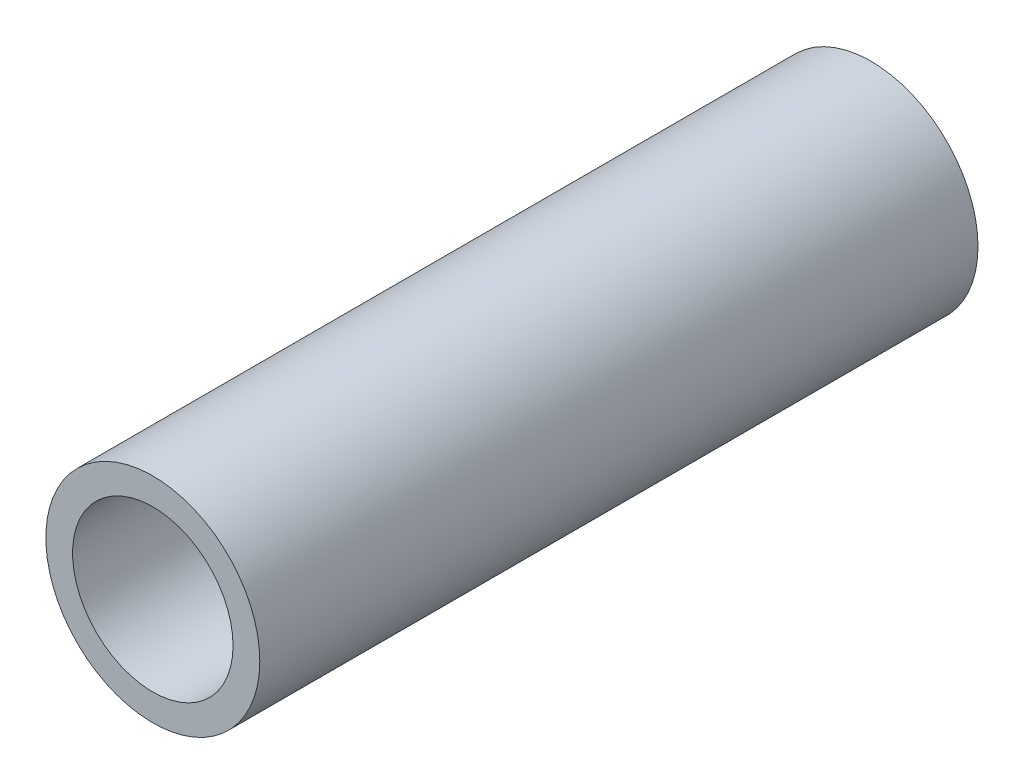
ISO-10303-21;
HEADER;
FILE_DESCRIPTION(('STEP AP214'),'2;1');
FILE_NAME('part.step','',(''),(''),'','','');
FILE_SCHEMA(('AUTOMOTIVE_DESIGN { 1 0 10303 214 1 1 1 1 }'));
ENDSEC;
DATA;
#1=APPLICATION_CONTEXT('core data for automotive mechanical design processes');
#2=APPLICATION_PROTOCOL_DEFINITION('international standard','automotive_design',2000,#1);
#3=PRODUCT_CONTEXT('',#1,'mechanical');
#4=PRODUCT('Part','Part','',(#3));
#5=PRODUCT_RELATED_PRODUCT_CATEGORY('part','',(#4));
#6=PRODUCT_DEFINITION_FORMATION('','',#4);
#7=PRODUCT_DEFINITION_CONTEXT('part definition',#1,'design');
#8=PRODUCT_DEFINITION('design','',#6,#7);
#9=PRODUCT_DEFINITION_SHAPE('','',#8);
#10=(LENGTH_UNIT() NAMED_UNIT(*) SI_UNIT(.MILLI.,.METRE.));
#11=(NAMED_UNIT(*) PLANE_ANGLE_UNIT() SI_UNIT($,.RADIAN.));
#12=(NAMED_UNIT(*) SI_UNIT($,.STERADIAN.) SOLID_ANGLE_UNIT());
#13=UNCERTAINTY_MEASURE_WITH_UNIT(LENGTH_MEASURE(1.E-05),#10,'distance_accuracy_value','');
#14=(GEOMETRIC_REPRESENTATION_CONTEXT(3) GLOBAL_UNCERTAINTY_ASSIGNED_CONTEXT((#13)) GLOBAL_UNIT_ASSIGNED_CONTEXT((#10,
#11,#12)) REPRESENTATION_CONTEXT('',''));
#15=CARTESIAN_POINT('',(0.,0.,0.));
#16=DIRECTION('',(0.,0.,1.));
#17=DIRECTION('',(1.,0.,0.));
#18=AXIS2_PLACEMENT_3D('',#15,#16,#17);
#19=CARTESIAN_POINT('',(0.,0.,28.2));
#20=DIRECTION('',(0.,0.,1.));
#21=DIRECTION('',(1.,0.,0.));
#22=AXIS2_PLACEMENT_3D('',#19,#20,#21);
#23=PLANE('',#22);
#24=CARTESIAN_POINT('',(0.,0.,28.2));
#25=DIRECTION('',(0.,0.,1.));
#26=DIRECTION('',(1.,0.,0.));
#27=AXIS2_PLACEMENT_3D('',#24,#25,#26);
#28=CIRCLE('',#27,4.2);
#29=CARTESIAN_POINT('',(4.2,0.,28.2));
#30=VERTEX_POINT('',#29);
#31=EDGE_CURVE('E10',#30,#30,#28,.T.);
#32=ORIENTED_EDGE('',*,*,#31,.T.);
#33=EDGE_LOOP('',(#32));
#34=FACE_BOUND('',#33,.T.);
#35=CARTESIAN_POINT('',(0.,0.,28.2));
#36=DIRECTION('',(0.,0.,1.));
#37=DIRECTION('',(1.,0.,0.));
#38=AXIS2_PLACEMENT_3D('',#35,#36,#37);
#39=CIRCLE('',#38,3.15);
#40=CARTESIAN_POINT('',(3.15,0.,28.2));
#41=VERTEX_POINT('',#40);
#42=EDGE_CURVE('E48',#41,#41,#39,.T.);
#43=ORIENTED_EDGE('',*,*,#42,.F.);
#44=EDGE_LOOP('',(#43));
#45=FACE_BOUND('',#44,.T.);
#46=ADVANCED_FACE('F40',(#34,#45),#23,.T.);
#47=CARTESIAN_POINT('',(0.,0.,0.));
#48=DIRECTION('',(0.,0.,1.));
#49=DIRECTION('',(1.,0.,0.));
#50=AXIS2_PLACEMENT_3D('',#47,#48,#49);
#51=PLANE('',#50);
#52=CARTESIAN_POINT('',(0.,0.,0.));
#53=DIRECTION('',(0.,0.,1.));
#54=DIRECTION('',(1.,0.,0.));
#55=AXIS2_PLACEMENT_3D('',#52,#53,#54);
#56=CIRCLE('',#55,4.2);
#57=CARTESIAN_POINT('',(4.2,0.,0.));
#58=VERTEX_POINT('',#57);
#59=EDGE_CURVE('E41',#58,#58,#56,.T.);
#60=ORIENTED_EDGE('',*,*,#59,.F.);
#61=EDGE_LOOP('',(#60));
#62=FACE_BOUND('',#61,.T.);
#63=CARTESIAN_POINT('',(0.,0.,0.));
#64=DIRECTION('',(0.,0.,1.));
#65=DIRECTION('',(1.,0.,0.));
#66=AXIS2_PLACEMENT_3D('',#63,#64,#65);
#67=CIRCLE('',#66,3.15);
#68=CARTESIAN_POINT('',(3.15,0.,0.));
#69=VERTEX_POINT('',#68);
#70=EDGE_CURVE('E49',#69,#69,#67,.T.);
#71=ORIENTED_EDGE('',*,*,#70,.T.);
#72=EDGE_LOOP('',(#71));
#73=FACE_BOUND('',#72,.T.);
#74=ADVANCED_FACE('F58',(#62,#73),#51,.F.);
#75=CARTESIAN_POINT('',(0.,0.,28.2));
#76=DIRECTION('',(0.,0.,-1.));
#77=DIRECTION('',(-1.,0.,0.));
#78=AXIS2_PLACEMENT_3D('',#75,#76,#77);
#79=CYLINDRICAL_SURFACE('',#78,4.2);
#80=ORIENTED_EDGE('',*,*,#31,.F.);
#81=EDGE_LOOP('',(#80));
#82=FACE_BOUND('',#81,.T.);
#83=ORIENTED_EDGE('',*,*,#59,.T.);
#84=EDGE_LOOP('',(#83));
#85=FACE_BOUND('',#84,.T.);
#86=ADVANCED_FACE('F39',(#82,#85),#79,.T.);
#87=CARTESIAN_POINT('',(0.,0.,28.2));
#88=DIRECTION('',(0.,0.,-1.));
#89=DIRECTION('',(-1.,0.,0.));
#90=AXIS2_PLACEMENT_3D('',#87,#88,#89);
#91=CYLINDRICAL_SURFACE('',#90,3.15);
#92=ORIENTED_EDGE('',*,*,#42,.T.);
#93=EDGE_LOOP('',(#92));
#94=FACE_BOUND('',#93,.T.);
#95=ORIENTED_EDGE('',*,*,#70,.F.);
#96=EDGE_LOOP('',(#95));
#97=FACE_BOUND('',#96,.T.);
#98=ADVANCED_FACE('F57',(#94,#97),#91,.F.);
#99=CLOSED_SHELL('',(#46,#74,#86,#98));
#100=MANIFOLD_SOLID_BREP('B2',#99);
#101=ADVANCED_BREP_SHAPE_REPRESENTATION('',(#18,#100),#14);
#102=SHAPE_DEFINITION_REPRESENTATION(#9,#101);
ENDSEC;
END-ISO-10303-21;
